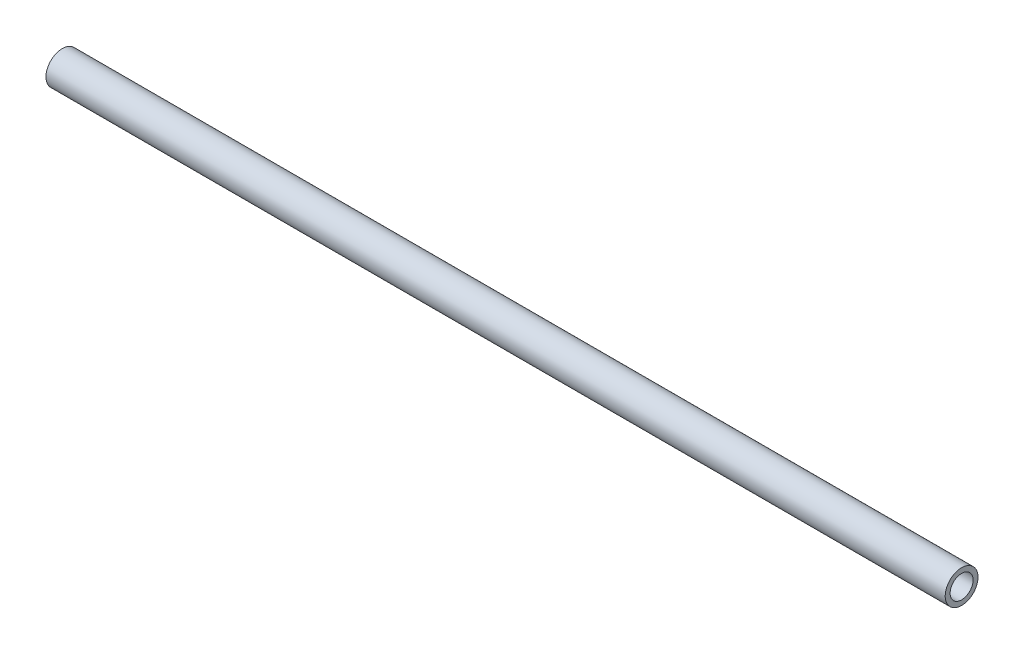
ISO-10303-21;
HEADER;
FILE_DESCRIPTION(('STEP AP214'),'2;1');
FILE_NAME('part.step','',(''),(''),'','','');
FILE_SCHEMA(('AUTOMOTIVE_DESIGN { 1 0 10303 214 1 1 1 1 }'));
ENDSEC;
DATA;
#1=APPLICATION_CONTEXT('core data for automotive mechanical design processes');
#2=APPLICATION_PROTOCOL_DEFINITION('international standard','automotive_design',2000,#1);
#3=PRODUCT_CONTEXT('',#1,'mechanical');
#4=PRODUCT('Part','Part','',(#3));
#5=PRODUCT_RELATED_PRODUCT_CATEGORY('part','',(#4));
#6=PRODUCT_DEFINITION_FORMATION('','',#4);
#7=PRODUCT_DEFINITION_CONTEXT('part definition',#1,'design');
#8=PRODUCT_DEFINITION('design','',#6,#7);
#9=PRODUCT_DEFINITION_SHAPE('','',#8);
#10=(LENGTH_UNIT() NAMED_UNIT(*) SI_UNIT(.MILLI.,.METRE.));
#11=(NAMED_UNIT(*) PLANE_ANGLE_UNIT() SI_UNIT($,.RADIAN.));
#12=(NAMED_UNIT(*) SI_UNIT($,.STERADIAN.) SOLID_ANGLE_UNIT());
#13=UNCERTAINTY_MEASURE_WITH_UNIT(LENGTH_MEASURE(1.E-05),#10,'distance_accuracy_value','');
#14=(GEOMETRIC_REPRESENTATION_CONTEXT(3) GLOBAL_UNCERTAINTY_ASSIGNED_CONTEXT((#13)) GLOBAL_UNIT_ASSIGNED_CONTEXT((#10,
#11,#12)) REPRESENTATION_CONTEXT('',''));
#15=CARTESIAN_POINT('',(0.,0.,0.));
#16=DIRECTION('',(0.,0.,1.));
#17=DIRECTION('',(1.,0.,0.));
#18=AXIS2_PLACEMENT_3D('',#15,#16,#17);
#19=CARTESIAN_POINT('',(274.247606775,6.99999999999994,0.));
#20=DIRECTION('',(1.,0.,0.));
#21=DIRECTION('',(0.,0.,-1.));
#22=AXIS2_PLACEMENT_3D('',#19,#20,#21);
#23=PLANE('',#22);
#24=CARTESIAN_POINT('',(274.247606775,0.,0.));
#25=DIRECTION('',(1.,0.,0.));
#26=DIRECTION('',(0.,0.,-1.));
#27=AXIS2_PLACEMENT_3D('',#24,#25,#26);
#28=CIRCLE('',#27,9.99999999999993);
#29=CARTESIAN_POINT('',(274.247606775,0.,-9.99999999999993));
#30=VERTEX_POINT('',#29);
#31=EDGE_CURVE('E45',#30,#30,#28,.T.);
#32=ORIENTED_EDGE('',*,*,#31,.T.);
#33=EDGE_LOOP('',(#32));
#34=FACE_BOUND('',#33,.T.);
#35=CARTESIAN_POINT('',(274.247606775,0.,0.));
#36=DIRECTION('',(1.,0.,0.));
#37=DIRECTION('',(0.,0.,-1.));
#38=AXIS2_PLACEMENT_3D('',#35,#36,#37);
#39=CIRCLE('',#38,6.99999999999994);
#40=CARTESIAN_POINT('',(274.247606775,0.,-6.99999999999994));
#41=VERTEX_POINT('',#40);
#42=EDGE_CURVE('E10',#41,#41,#39,.T.);
#43=ORIENTED_EDGE('',*,*,#42,.F.);
#44=EDGE_LOOP('',(#43));
#45=FACE_BOUND('',#44,.T.);
#46=ADVANCED_FACE('F31',(#34,#45),#23,.T.);
#47=CARTESIAN_POINT('',(265.225,0.,0.));
#48=DIRECTION('',(1.,0.,0.));
#49=DIRECTION('',(0.,0.,-1.));
#50=AXIS2_PLACEMENT_3D('',#47,#48,#49);
#51=CYLINDRICAL_SURFACE('',#50,6.99999999999994);
#52=ORIENTED_EDGE('',*,*,#42,.T.);
#53=EDGE_LOOP('',(#52));
#54=FACE_BOUND('',#53,.T.);
#55=CARTESIAN_POINT('',(-274.247606775,0.,0.));
#56=DIRECTION('',(1.,0.,0.));
#57=DIRECTION('',(0.,0.,-1.));
#58=AXIS2_PLACEMENT_3D('',#55,#56,#57);
#59=CIRCLE('',#58,6.99999999999994);
#60=CARTESIAN_POINT('',(-274.247606775,0.,-6.99999999999994));
#61=VERTEX_POINT('',#60);
#62=EDGE_CURVE('E37',#61,#61,#59,.T.);
#63=ORIENTED_EDGE('',*,*,#62,.F.);
#64=EDGE_LOOP('',(#63));
#65=FACE_BOUND('',#64,.T.);
#66=ADVANCED_FACE('F61',(#54,#65),#51,.F.);
#67=CARTESIAN_POINT('',(-274.247606775,9.99999999999993,0.));
#68=DIRECTION('',(-1.,0.,0.));
#69=DIRECTION('',(0.,0.,1.));
#70=AXIS2_PLACEMENT_3D('',#67,#68,#69);
#71=PLANE('',#70);
#72=ORIENTED_EDGE('',*,*,#62,.T.);
#73=EDGE_LOOP('',(#72));
#74=FACE_BOUND('',#73,.T.);
#75=CARTESIAN_POINT('',(-274.247606775,0.,0.));
#76=DIRECTION('',(1.,0.,0.));
#77=DIRECTION('',(0.,0.,-1.));
#78=AXIS2_PLACEMENT_3D('',#75,#76,#77);
#79=CIRCLE('',#78,9.99999999999993);
#80=CARTESIAN_POINT('',(-274.247606775,0.,-9.99999999999993));
#81=VERTEX_POINT('',#80);
#82=EDGE_CURVE('E41',#81,#81,#79,.T.);
#83=ORIENTED_EDGE('',*,*,#82,.F.);
#84=EDGE_LOOP('',(#83));
#85=FACE_BOUND('',#84,.T.);
#86=ADVANCED_FACE('F55',(#74,#85),#71,.T.);
#87=CARTESIAN_POINT('',(265.225,0.,0.));
#88=DIRECTION('',(1.,0.,0.));
#89=DIRECTION('',(0.,0.,-1.));
#90=AXIS2_PLACEMENT_3D('',#87,#88,#89);
#91=CYLINDRICAL_SURFACE('',#90,9.99999999999993);
#92=ORIENTED_EDGE('',*,*,#82,.T.);
#93=EDGE_LOOP('',(#92));
#94=FACE_BOUND('',#93,.T.);
#95=ORIENTED_EDGE('',*,*,#31,.F.);
#96=EDGE_LOOP('',(#95));
#97=FACE_BOUND('',#96,.T.);
#98=ADVANCED_FACE('F53',(#94,#97),#91,.T.);
#99=CLOSED_SHELL('',(#46,#66,#86,#98));
#100=MANIFOLD_SOLID_BREP('B2',#99);
#101=ADVANCED_BREP_SHAPE_REPRESENTATION('',(#18,#100),#14);
#102=SHAPE_DEFINITION_REPRESENTATION(#9,#101);
ENDSEC;
END-ISO-10303-21;
